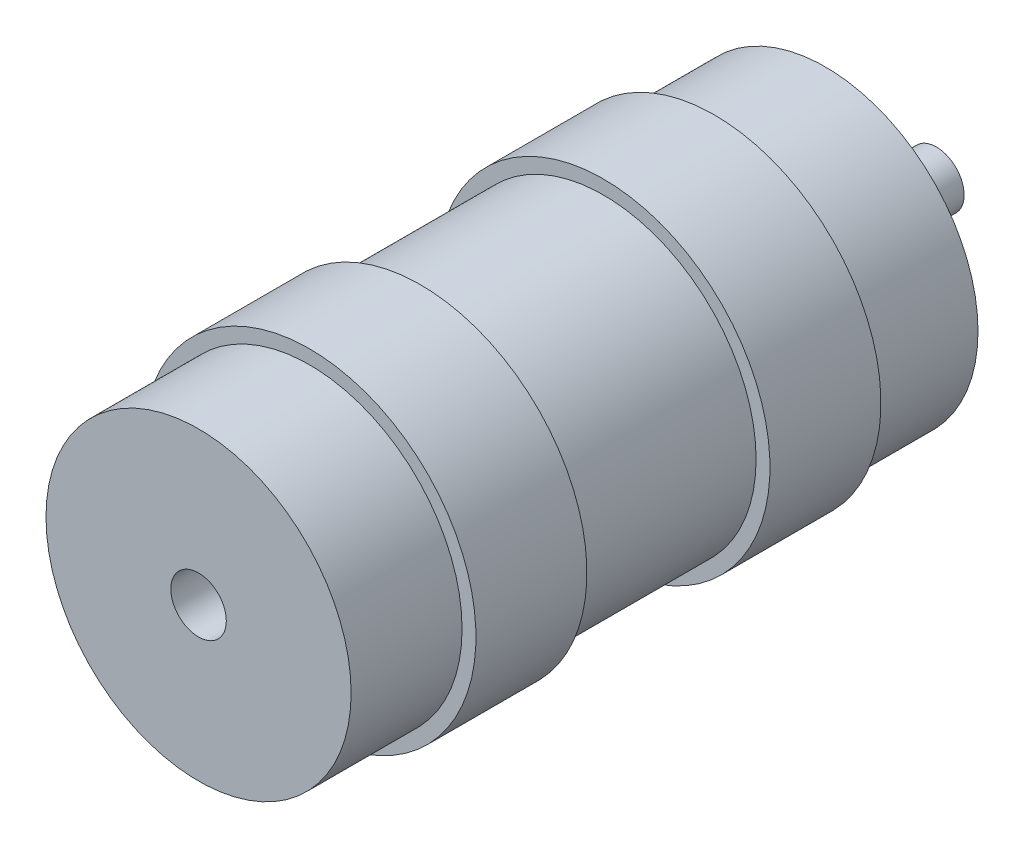
ISO-10303-21;
HEADER;
FILE_DESCRIPTION(('STEP AP214'),'2;1');
FILE_NAME('part.step','',(''),(''),'','','');
FILE_SCHEMA(('AUTOMOTIVE_DESIGN { 1 0 10303 214 1 1 1 1 }'));
ENDSEC;
DATA;
#1=APPLICATION_CONTEXT('core data for automotive mechanical design processes');
#2=APPLICATION_PROTOCOL_DEFINITION('international standard','automotive_design',2000,#1);
#3=PRODUCT_CONTEXT('',#1,'mechanical');
#4=PRODUCT('Part','Part','',(#3));
#5=PRODUCT_RELATED_PRODUCT_CATEGORY('part','',(#4));
#6=PRODUCT_DEFINITION_FORMATION('','',#4);
#7=PRODUCT_DEFINITION_CONTEXT('part definition',#1,'design');
#8=PRODUCT_DEFINITION('design','',#6,#7);
#9=PRODUCT_DEFINITION_SHAPE('','',#8);
#10=(LENGTH_UNIT() NAMED_UNIT(*) SI_UNIT(.MILLI.,.METRE.));
#11=(NAMED_UNIT(*) PLANE_ANGLE_UNIT() SI_UNIT($,.RADIAN.));
#12=(NAMED_UNIT(*) SI_UNIT($,.STERADIAN.) SOLID_ANGLE_UNIT());
#13=UNCERTAINTY_MEASURE_WITH_UNIT(LENGTH_MEASURE(1.E-05),#10,'distance_accuracy_value','');
#14=(GEOMETRIC_REPRESENTATION_CONTEXT(3) GLOBAL_UNCERTAINTY_ASSIGNED_CONTEXT((#13)) GLOBAL_UNIT_ASSIGNED_CONTEXT((#10,
#11,#12)) REPRESENTATION_CONTEXT('',''));
#15=CARTESIAN_POINT('',(0.,0.,0.));
#16=DIRECTION('',(0.,0.,1.));
#17=DIRECTION('',(1.,0.,0.));
#18=AXIS2_PLACEMENT_3D('',#15,#16,#17);
#19=CARTESIAN_POINT('',(0.,0.,20.));
#20=DIRECTION('',(0.,0.,-1.));
#21=DIRECTION('',(-1.,0.,0.));
#22=AXIS2_PLACEMENT_3D('',#19,#20,#21);
#23=CYLINDRICAL_SURFACE('',#22,5.);
#24=CARTESIAN_POINT('',(0.,0.,20.));
#25=DIRECTION('',(0.,0.,1.));
#26=DIRECTION('',(1.,0.,0.));
#27=AXIS2_PLACEMENT_3D('',#24,#25,#26);
#28=CIRCLE('',#27,5.);
#29=CARTESIAN_POINT('',(5.,0.,20.));
#30=VERTEX_POINT('',#29);
#31=EDGE_CURVE('E41',#30,#30,#28,.T.);
#32=ORIENTED_EDGE('',*,*,#31,.F.);
#33=EDGE_LOOP('',(#32));
#34=FACE_BOUND('',#33,.T.);
#35=CARTESIAN_POINT('',(0.,0.,0.));
#36=DIRECTION('',(0.,0.,1.));
#37=DIRECTION('',(1.,0.,0.));
#38=AXIS2_PLACEMENT_3D('',#35,#36,#37);
#39=CIRCLE('',#38,5.);
#40=CARTESIAN_POINT('',(5.,0.,0.));
#41=VERTEX_POINT('',#40);
#42=EDGE_CURVE('E46',#41,#41,#39,.T.);
#43=ORIENTED_EDGE('',*,*,#42,.T.);
#44=EDGE_LOOP('',(#43));
#45=FACE_BOUND('',#44,.T.);
#46=ADVANCED_FACE('F31',(#34,#45),#23,.T.);
#47=CARTESIAN_POINT('',(0.,0.,0.));
#48=DIRECTION('',(0.,0.,1.));
#49=DIRECTION('',(1.,0.,0.));
#50=AXIS2_PLACEMENT_3D('',#47,#48,#49);
#51=PLANE('',#50);
#52=ORIENTED_EDGE('',*,*,#42,.F.);
#53=EDGE_LOOP('',(#52));
#54=FACE_BOUND('',#53,.T.);
#55=ADVANCED_FACE('F81',(#54),#51,.F.);
#56=CARTESIAN_POINT('',(0.,0.,133.));
#57=DIRECTION('',(0.,0.,-1.));
#58=DIRECTION('',(-1.,0.,0.));
#59=AXIS2_PLACEMENT_3D('',#56,#57,#58);
#60=CYLINDRICAL_SURFACE('',#59,27.5);
#61=CARTESIAN_POINT('',(0.,0.,40.));
#62=DIRECTION('',(0.,0.,-1.));
#63=DIRECTION('',(-1.,0.,0.));
#64=AXIS2_PLACEMENT_3D('',#61,#62,#63);
#65=CIRCLE('',#64,27.5);
#66=CARTESIAN_POINT('',(-27.5,0.,40.));
#67=VERTEX_POINT('',#66);
#68=EDGE_CURVE('E49',#67,#67,#65,.T.);
#69=ORIENTED_EDGE('',*,*,#68,.T.);
#70=EDGE_LOOP('',(#69));
#71=FACE_BOUND('',#70,.T.);
#72=CARTESIAN_POINT('',(0.,0.,20.));
#73=DIRECTION('',(0.,0.,1.));
#74=DIRECTION('',(1.,0.,0.));
#75=AXIS2_PLACEMENT_3D('',#72,#73,#74);
#76=CIRCLE('',#75,27.5);
#77=CARTESIAN_POINT('',(27.5,0.,20.));
#78=VERTEX_POINT('',#77);
#79=EDGE_CURVE('E75',#78,#78,#76,.T.);
#80=ORIENTED_EDGE('',*,*,#79,.T.);
#81=EDGE_LOOP('',(#80));
#82=FACE_BOUND('',#81,.T.);
#83=ADVANCED_FACE('F83',(#71,#82),#60,.T.);
#84=CARTESIAN_POINT('',(0.,0.,20.));
#85=DIRECTION('',(0.,0.,1.));
#86=DIRECTION('',(1.,0.,0.));
#87=AXIS2_PLACEMENT_3D('',#84,#85,#86);
#88=PLANE('',#87);
#89=ORIENTED_EDGE('',*,*,#31,.T.);
#90=EDGE_LOOP('',(#89));
#91=FACE_BOUND('',#90,.T.);
#92=ORIENTED_EDGE('',*,*,#79,.F.);
#93=EDGE_LOOP('',(#92));
#94=FACE_BOUND('',#93,.T.);
#95=ADVANCED_FACE('F88',(#91,#94),#88,.F.);
#96=CARTESIAN_POINT('',(0.,0.,60.));
#97=DIRECTION('',(0.,0.,-1.));
#98=DIRECTION('',(-1.,0.,0.));
#99=AXIS2_PLACEMENT_3D('',#96,#97,#98);
#100=CYLINDRICAL_SURFACE('',#99,30.);
#101=CARTESIAN_POINT('',(0.,0.,60.));
#102=DIRECTION('',(0.,0.,-1.));
#103=DIRECTION('',(-1.,0.,0.));
#104=AXIS2_PLACEMENT_3D('',#101,#102,#103);
#105=CIRCLE('',#104,30.);
#106=CARTESIAN_POINT('',(-30.,0.,60.));
#107=VERTEX_POINT('',#106);
#108=EDGE_CURVE('E58',#107,#107,#105,.T.);
#109=ORIENTED_EDGE('',*,*,#108,.T.);
#110=EDGE_LOOP('',(#109));
#111=FACE_BOUND('',#110,.T.);
#112=CARTESIAN_POINT('',(0.,0.,40.));
#113=DIRECTION('',(0.,0.,-1.));
#114=DIRECTION('',(-1.,0.,0.));
#115=AXIS2_PLACEMENT_3D('',#112,#113,#114);
#116=CIRCLE('',#115,30.);
#117=CARTESIAN_POINT('',(-30.,0.,40.));
#118=VERTEX_POINT('',#117);
#119=EDGE_CURVE('E53',#118,#118,#116,.T.);
#120=ORIENTED_EDGE('',*,*,#119,.F.);
#121=EDGE_LOOP('',(#120));
#122=FACE_BOUND('',#121,.T.);
#123=ADVANCED_FACE('F97',(#111,#122),#100,.T.);
#124=CARTESIAN_POINT('',(0.,0.,60.));
#125=DIRECTION('',(0.,0.,-1.));
#126=DIRECTION('',(-1.,0.,0.));
#127=AXIS2_PLACEMENT_3D('',#124,#125,#126);
#128=PLANE('',#127);
#129=CARTESIAN_POINT('',(0.,0.,60.));
#130=DIRECTION('',(0.,0.,-1.));
#131=DIRECTION('',(-1.,0.,0.));
#132=AXIS2_PLACEMENT_3D('',#129,#130,#131);
#133=CIRCLE('',#132,27.5);
#134=CARTESIAN_POINT('',(-27.5,0.,60.));
#135=VERTEX_POINT('',#134);
#136=EDGE_CURVE('E37',#135,#135,#133,.T.);
#137=ORIENTED_EDGE('',*,*,#136,.T.);
#138=EDGE_LOOP('',(#137));
#139=FACE_BOUND('',#138,.T.);
#140=ORIENTED_EDGE('',*,*,#108,.F.);
#141=EDGE_LOOP('',(#140));
#142=FACE_BOUND('',#141,.T.);
#143=ADVANCED_FACE('F106',(#139,#142),#128,.F.);
#144=CARTESIAN_POINT('',(0.,0.,40.));
#145=DIRECTION('',(0.,0.,-1.));
#146=DIRECTION('',(-1.,0.,0.));
#147=AXIS2_PLACEMENT_3D('',#144,#145,#146);
#148=PLANE('',#147);
#149=ORIENTED_EDGE('',*,*,#68,.F.);
#150=EDGE_LOOP('',(#149));
#151=FACE_BOUND('',#150,.T.);
#152=ORIENTED_EDGE('',*,*,#119,.T.);
#153=EDGE_LOOP('',(#152));
#154=FACE_BOUND('',#153,.T.);
#155=ADVANCED_FACE('F110',(#151,#154),#148,.T.);
#156=CARTESIAN_POINT('',(0.,0.,93.));
#157=DIRECTION('',(0.,0.,-1.));
#158=DIRECTION('',(-1.,0.,0.));
#159=AXIS2_PLACEMENT_3D('',#156,#157,#158);
#160=CIRCLE('',#159,27.5);
#161=CARTESIAN_POINT('',(-27.5,0.,93.));
#162=VERTEX_POINT('',#161);
#163=EDGE_CURVE('E51',#162,#162,#160,.T.);
#164=ORIENTED_EDGE('',*,*,#163,.T.);
#165=EDGE_LOOP('',(#164));
#166=FACE_BOUND('',#165,.T.);
#167=ORIENTED_EDGE('',*,*,#136,.F.);
#168=EDGE_LOOP('',(#167));
#169=FACE_BOUND('',#168,.T.);
#170=ADVANCED_FACE('F92',(#166,#169),#60,.T.);
#171=CARTESIAN_POINT('',(0.,0.,113.));
#172=DIRECTION('',(0.,0.,-1.));
#173=DIRECTION('',(-1.,0.,0.));
#174=AXIS2_PLACEMENT_3D('',#171,#172,#173);
#175=CYLINDRICAL_SURFACE('',#174,30.);
#176=CARTESIAN_POINT('',(0.,0.,113.));
#177=DIRECTION('',(0.,0.,-1.));
#178=DIRECTION('',(-1.,0.,0.));
#179=AXIS2_PLACEMENT_3D('',#176,#177,#178);
#180=CIRCLE('',#179,30.);
#181=CARTESIAN_POINT('',(-30.,0.,113.));
#182=VERTEX_POINT('',#181);
#183=EDGE_CURVE('E54',#182,#182,#180,.T.);
#184=ORIENTED_EDGE('',*,*,#183,.T.);
#185=EDGE_LOOP('',(#184));
#186=FACE_BOUND('',#185,.T.);
#187=CARTESIAN_POINT('',(0.,0.,93.));
#188=DIRECTION('',(0.,0.,-1.));
#189=DIRECTION('',(-1.,0.,0.));
#190=AXIS2_PLACEMENT_3D('',#187,#188,#189);
#191=CIRCLE('',#190,30.);
#192=CARTESIAN_POINT('',(-30.,0.,93.));
#193=VERTEX_POINT('',#192);
#194=EDGE_CURVE('E61',#193,#193,#191,.T.);
#195=ORIENTED_EDGE('',*,*,#194,.F.);
#196=EDGE_LOOP('',(#195));
#197=FACE_BOUND('',#196,.T.);
#198=ADVANCED_FACE('F114',(#186,#197),#175,.T.);
#199=CARTESIAN_POINT('',(0.,0.,113.));
#200=DIRECTION('',(0.,0.,-1.));
#201=DIRECTION('',(-1.,0.,0.));
#202=AXIS2_PLACEMENT_3D('',#199,#200,#201);
#203=PLANE('',#202);
#204=CARTESIAN_POINT('',(0.,0.,113.));
#205=DIRECTION('',(0.,0.,-1.));
#206=DIRECTION('',(-1.,0.,0.));
#207=AXIS2_PLACEMENT_3D('',#204,#205,#206);
#208=CIRCLE('',#207,27.5);
#209=CARTESIAN_POINT('',(-27.5,0.,113.));
#210=VERTEX_POINT('',#209);
#211=EDGE_CURVE('E10',#210,#210,#208,.T.);
#212=ORIENTED_EDGE('',*,*,#211,.T.);
#213=EDGE_LOOP('',(#212));
#214=FACE_BOUND('',#213,.T.);
#215=ORIENTED_EDGE('',*,*,#183,.F.);
#216=EDGE_LOOP('',(#215));
#217=FACE_BOUND('',#216,.T.);
#218=ADVANCED_FACE('F117',(#214,#217),#203,.F.);
#219=CARTESIAN_POINT('',(0.,0.,93.));
#220=DIRECTION('',(0.,0.,-1.));
#221=DIRECTION('',(-1.,0.,0.));
#222=AXIS2_PLACEMENT_3D('',#219,#220,#221);
#223=PLANE('',#222);
#224=ORIENTED_EDGE('',*,*,#163,.F.);
#225=EDGE_LOOP('',(#224));
#226=FACE_BOUND('',#225,.T.);
#227=ORIENTED_EDGE('',*,*,#194,.T.);
#228=EDGE_LOOP('',(#227));
#229=FACE_BOUND('',#228,.T.);
#230=ADVANCED_FACE('F102',(#226,#229),#223,.T.);
#231=CARTESIAN_POINT('',(0.,0.,133.));
#232=DIRECTION('',(0.,0.,1.));
#233=DIRECTION('',(1.,0.,0.));
#234=AXIS2_PLACEMENT_3D('',#231,#232,#233);
#235=PLANE('',#234);
#236=CARTESIAN_POINT('',(0.,0.,133.));
#237=DIRECTION('',(0.,0.,1.));
#238=DIRECTION('',(1.,0.,0.));
#239=AXIS2_PLACEMENT_3D('',#236,#237,#238);
#240=CIRCLE('',#239,5.);
#241=CARTESIAN_POINT('',(5.,0.,133.));
#242=VERTEX_POINT('',#241);
#243=EDGE_CURVE('E134',#242,#242,#240,.T.);
#244=ORIENTED_EDGE('',*,*,#243,.F.);
#245=EDGE_LOOP('',(#244));
#246=FACE_BOUND('',#245,.T.);
#247=CARTESIAN_POINT('',(0.,0.,133.));
#248=DIRECTION('',(0.,0.,1.));
#249=DIRECTION('',(1.,0.,0.));
#250=AXIS2_PLACEMENT_3D('',#247,#248,#249);
#251=CIRCLE('',#250,27.5);
#252=CARTESIAN_POINT('',(27.5,0.,133.));
#253=VERTEX_POINT('',#252);
#254=EDGE_CURVE('E72',#253,#253,#251,.T.);
#255=ORIENTED_EDGE('',*,*,#254,.T.);
#256=EDGE_LOOP('',(#255));
#257=FACE_BOUND('',#256,.T.);
#258=ADVANCED_FACE('F99',(#246,#257),#235,.T.);
#259=ORIENTED_EDGE('',*,*,#254,.F.);
#260=EDGE_LOOP('',(#259));
#261=FACE_BOUND('',#260,.T.);
#262=ORIENTED_EDGE('',*,*,#211,.F.);
#263=EDGE_LOOP('',(#262));
#264=FACE_BOUND('',#263,.T.);
#265=ADVANCED_FACE('F91',(#261,#264),#60,.T.);
#266=CARTESIAN_POINT('',(0.,0.,113.));
#267=DIRECTION('',(0.,0.,1.));
#268=DIRECTION('',(1.,0.,0.));
#269=AXIS2_PLACEMENT_3D('',#266,#267,#268);
#270=CYLINDRICAL_SURFACE('',#269,5.);
#271=CARTESIAN_POINT('',(0.,0.,113.));
#272=DIRECTION('',(0.,0.,1.));
#273=DIRECTION('',(1.,0.,0.));
#274=AXIS2_PLACEMENT_3D('',#271,#272,#273);
#275=CIRCLE('',#274,5.);
#276=CARTESIAN_POINT('',(5.,0.,113.));
#277=VERTEX_POINT('',#276);
#278=EDGE_CURVE('E66',#277,#277,#275,.T.);
#279=ORIENTED_EDGE('',*,*,#278,.F.);
#280=EDGE_LOOP('',(#279));
#281=FACE_BOUND('',#280,.T.);
#282=ORIENTED_EDGE('',*,*,#243,.T.);
#283=EDGE_LOOP('',(#282));
#284=FACE_BOUND('',#283,.T.);
#285=ADVANCED_FACE('F123',(#281,#284),#270,.F.);
#286=CARTESIAN_POINT('',(0.,0.,113.));
#287=DIRECTION('',(0.,0.,1.));
#288=DIRECTION('',(1.,0.,0.));
#289=AXIS2_PLACEMENT_3D('',#286,#287,#288);
#290=PLANE('',#289);
#291=ORIENTED_EDGE('',*,*,#278,.T.);
#292=EDGE_LOOP('',(#291));
#293=FACE_BOUND('',#292,.T.);
#294=ADVANCED_FACE('F126',(#293),#290,.T.);
#295=CLOSED_SHELL('',(#46,#55,#83,#95,#123,#143,#155,#170,#198,#218,#230,#258,#265,#285,#294));
#296=MANIFOLD_SOLID_BREP('B2',#295);
#297=ADVANCED_BREP_SHAPE_REPRESENTATION('',(#18,#296),#14);
#298=SHAPE_DEFINITION_REPRESENTATION(#9,#297);
ENDSEC;
END-ISO-10303-21;
